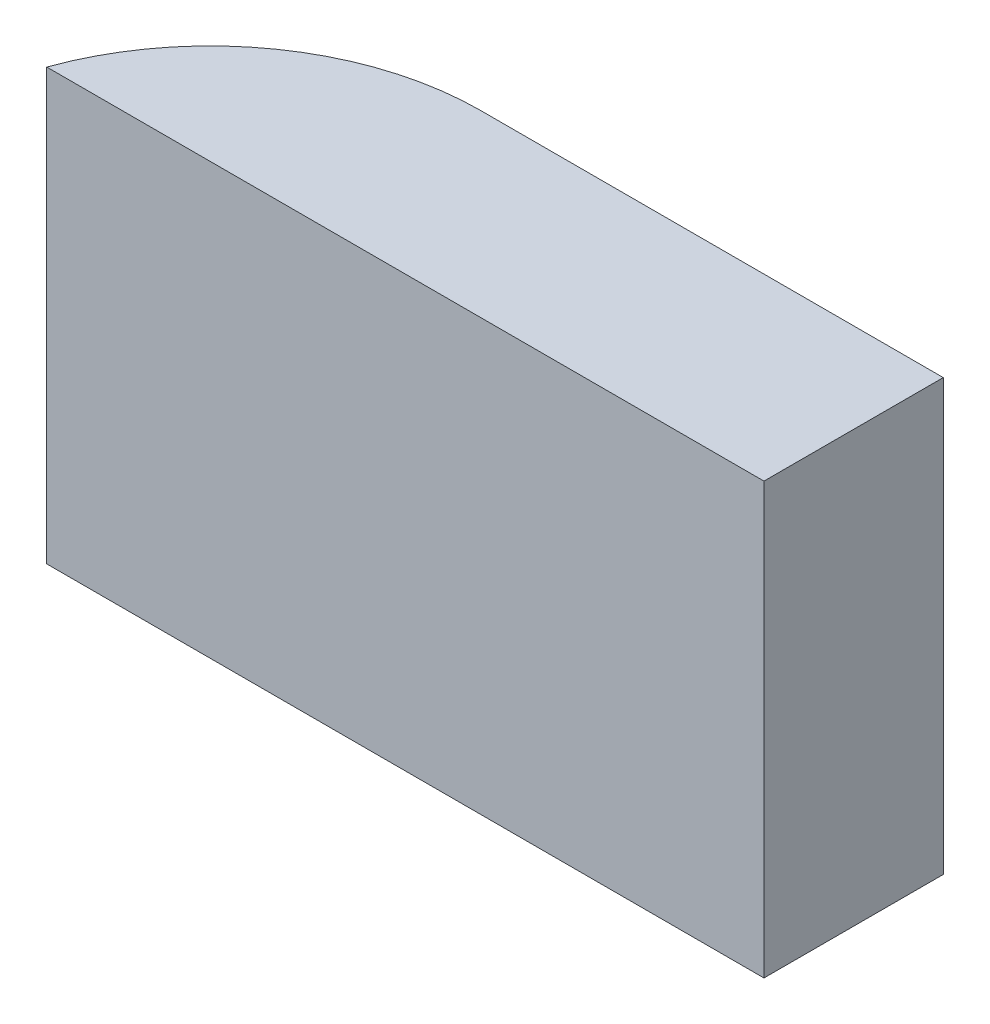
ISO-10303-21;
HEADER;
FILE_DESCRIPTION(('STEP AP214'),'2;1');
FILE_NAME('part.step','',(''),(''),'','','');
FILE_SCHEMA(('AUTOMOTIVE_DESIGN { 1 0 10303 214 1 1 1 1 }'));
ENDSEC;
DATA;
#1=APPLICATION_CONTEXT('core data for automotive mechanical design processes');
#2=APPLICATION_PROTOCOL_DEFINITION('international standard','automotive_design',2000,#1);
#3=PRODUCT_CONTEXT('',#1,'mechanical');
#4=PRODUCT('Part','Part','',(#3));
#5=PRODUCT_RELATED_PRODUCT_CATEGORY('part','',(#4));
#6=PRODUCT_DEFINITION_FORMATION('','',#4);
#7=PRODUCT_DEFINITION_CONTEXT('part definition',#1,'design');
#8=PRODUCT_DEFINITION('design','',#6,#7);
#9=PRODUCT_DEFINITION_SHAPE('','',#8);
#10=(LENGTH_UNIT() NAMED_UNIT(*) SI_UNIT(.MILLI.,.METRE.));
#11=(NAMED_UNIT(*) PLANE_ANGLE_UNIT() SI_UNIT($,.RADIAN.));
#12=(NAMED_UNIT(*) SI_UNIT($,.STERADIAN.) SOLID_ANGLE_UNIT());
#13=UNCERTAINTY_MEASURE_WITH_UNIT(LENGTH_MEASURE(1.E-05),#10,'distance_accuracy_value','');
#14=(GEOMETRIC_REPRESENTATION_CONTEXT(3) GLOBAL_UNCERTAINTY_ASSIGNED_CONTEXT((#13)) GLOBAL_UNIT_ASSIGNED_CONTEXT((#10,
#11,#12)) REPRESENTATION_CONTEXT('',''));
#15=CARTESIAN_POINT('',(0.,0.,0.));
#16=DIRECTION('',(0.,0.,1.));
#17=DIRECTION('',(1.,0.,0.));
#18=AXIS2_PLACEMENT_3D('',#15,#16,#17);
#19=CARTESIAN_POINT('',(0.,76.2,0.));
#20=DIRECTION('',(0.,0.,1.));
#21=DIRECTION('',(1.,0.,0.));
#22=AXIS2_PLACEMENT_3D('',#19,#20,#21);
#23=PLANE('',#22);
#24=DIRECTION('',(-1.,0.,0.));
#25=VECTOR('',#24,1.);
#26=CARTESIAN_POINT('',(0.,0.,0.));
#27=LINE('',#26,#25);
#28=CARTESIAN_POINT('',(0.,0.,0.));
#29=VERTEX_POINT('',#28);
#30=CARTESIAN_POINT('',(-81.8677685950414,0.,0.));
#31=VERTEX_POINT('',#30);
#32=EDGE_CURVE('E107',#29,#31,#27,.T.);
#33=ORIENTED_EDGE('',*,*,#32,.T.);
#34=DIRECTION('',(0.,-1.,0.));
#35=VECTOR('',#34,1.);
#36=CARTESIAN_POINT('',(-81.8677685950414,76.2,0.));
#37=LINE('',#36,#35);
#38=CARTESIAN_POINT('',(-81.8677685950414,76.2,0.));
#39=VERTEX_POINT('',#38);
#40=EDGE_CURVE('E11',#39,#31,#37,.T.);
#41=ORIENTED_EDGE('',*,*,#40,.F.);
#42=DIRECTION('',(-1.,0.,0.));
#43=VECTOR('',#42,1.);
#44=CARTESIAN_POINT('',(0.,76.2,0.));
#45=LINE('',#44,#43);
#46=CARTESIAN_POINT('',(0.,76.2,0.));
#47=VERTEX_POINT('',#46);
#48=EDGE_CURVE('E91',#47,#39,#45,.T.);
#49=ORIENTED_EDGE('',*,*,#48,.F.);
#50=DIRECTION('',(0.,-1.,0.));
#51=VECTOR('',#50,1.);
#52=CARTESIAN_POINT('',(0.,76.2,0.));
#53=LINE('',#52,#51);
#54=EDGE_CURVE('E103',#47,#29,#53,.T.);
#55=ORIENTED_EDGE('',*,*,#54,.T.);
#56=EDGE_LOOP('',(#33,#41,#49,#55));
#57=FACE_BOUND('',#56,.T.);
#58=ADVANCED_FACE('F39',(#57),#23,.F.);
#59=CARTESIAN_POINT('',(-81.8677685950414,76.2,47.9524537258383));
#60=DIRECTION('',(0.,-1.,0.));
#61=DIRECTION('',(0.,0.,-1.));
#62=AXIS2_PLACEMENT_3D('',#59,#60,#61);
#63=CYLINDRICAL_SURFACE('',#62,47.9524537258383);
#64=CARTESIAN_POINT('',(-81.8677685950414,0.,47.9524537258383));
#65=DIRECTION('',(0.,1.,0.));
#66=DIRECTION('',(0.,0.,1.));
#67=AXIS2_PLACEMENT_3D('',#64,#65,#66);
#68=CIRCLE('',#67,47.9524537258383);
#69=CARTESIAN_POINT('',(-127.,0.,31.75));
#70=VERTEX_POINT('',#69);
#71=EDGE_CURVE('E96',#31,#70,#68,.T.);
#72=ORIENTED_EDGE('',*,*,#71,.T.);
#73=DIRECTION('',(0.,-1.,0.));
#74=VECTOR('',#73,1.);
#75=CARTESIAN_POINT('',(-127.,76.2,31.75));
#76=LINE('',#75,#74);
#77=CARTESIAN_POINT('',(-127.,76.2,31.75));
#78=VERTEX_POINT('',#77);
#79=EDGE_CURVE('E48',#78,#70,#76,.T.);
#80=ORIENTED_EDGE('',*,*,#79,.F.);
#81=CARTESIAN_POINT('',(-81.8677685950414,76.2,47.9524537258383));
#82=DIRECTION('',(0.,1.,0.));
#83=DIRECTION('',(0.,0.,1.));
#84=AXIS2_PLACEMENT_3D('',#81,#82,#83);
#85=CIRCLE('',#84,47.9524537258383);
#86=EDGE_CURVE('E86',#39,#78,#85,.T.);
#87=ORIENTED_EDGE('',*,*,#86,.F.);
#88=ORIENTED_EDGE('',*,*,#40,.T.);
#89=EDGE_LOOP('',(#72,#80,#87,#88));
#90=FACE_BOUND('',#89,.T.);
#91=ADVANCED_FACE('F95',(#90),#63,.T.);
#92=CARTESIAN_POINT('',(0.,76.2,31.75));
#93=DIRECTION('',(0.,0.,-1.));
#94=DIRECTION('',(-1.,0.,0.));
#95=AXIS2_PLACEMENT_3D('',#92,#93,#94);
#96=PLANE('',#95);
#97=DIRECTION('',(1.,0.,0.));
#98=VECTOR('',#97,1.);
#99=CARTESIAN_POINT('',(0.,0.,31.75));
#100=LINE('',#99,#98);
#101=CARTESIAN_POINT('',(0.,0.,31.75));
#102=VERTEX_POINT('',#101);
#103=EDGE_CURVE('E73',#70,#102,#100,.T.);
#104=ORIENTED_EDGE('',*,*,#103,.T.);
#105=DIRECTION('',(0.,-1.,0.));
#106=VECTOR('',#105,1.);
#107=CARTESIAN_POINT('',(0.,76.2,31.75));
#108=LINE('',#107,#106);
#109=CARTESIAN_POINT('',(0.,76.2,31.75));
#110=VERTEX_POINT('',#109);
#111=EDGE_CURVE('E98',#110,#102,#108,.T.);
#112=ORIENTED_EDGE('',*,*,#111,.F.);
#113=DIRECTION('',(1.,0.,0.));
#114=VECTOR('',#113,1.);
#115=CARTESIAN_POINT('',(0.,76.2,31.75));
#116=LINE('',#115,#114);
#117=EDGE_CURVE('E89',#78,#110,#116,.T.);
#118=ORIENTED_EDGE('',*,*,#117,.F.);
#119=ORIENTED_EDGE('',*,*,#79,.T.);
#120=EDGE_LOOP('',(#104,#112,#118,#119));
#121=FACE_BOUND('',#120,.T.);
#122=ADVANCED_FACE('F99',(#121),#96,.F.);
#123=CARTESIAN_POINT('',(0.,76.2,0.));
#124=DIRECTION('',(-1.,0.,0.));
#125=DIRECTION('',(0.,0.,1.));
#126=AXIS2_PLACEMENT_3D('',#123,#124,#125);
#127=PLANE('',#126);
#128=DIRECTION('',(0.,0.,-1.));
#129=VECTOR('',#128,1.);
#130=CARTESIAN_POINT('',(0.,0.,0.));
#131=LINE('',#130,#129);
#132=EDGE_CURVE('E79',#102,#29,#131,.T.);
#133=ORIENTED_EDGE('',*,*,#132,.T.);
#134=ORIENTED_EDGE('',*,*,#54,.F.);
#135=DIRECTION('',(0.,0.,-1.));
#136=VECTOR('',#135,1.);
#137=CARTESIAN_POINT('',(0.,76.2,0.));
#138=LINE('',#137,#136);
#139=EDGE_CURVE('E56',#110,#47,#138,.T.);
#140=ORIENTED_EDGE('',*,*,#139,.F.);
#141=ORIENTED_EDGE('',*,*,#111,.T.);
#142=EDGE_LOOP('',(#133,#134,#140,#141));
#143=FACE_BOUND('',#142,.T.);
#144=ADVANCED_FACE('F120',(#143),#127,.F.);
#145=CARTESIAN_POINT('',(-81.8677685950414,76.2,47.9524537258383));
#146=DIRECTION('',(0.,1.,0.));
#147=DIRECTION('',(0.,0.,1.));
#148=AXIS2_PLACEMENT_3D('',#145,#146,#147);
#149=PLANE('',#148);
#150=ORIENTED_EDGE('',*,*,#48,.T.);
#151=ORIENTED_EDGE('',*,*,#86,.T.);
#152=ORIENTED_EDGE('',*,*,#117,.T.);
#153=ORIENTED_EDGE('',*,*,#139,.T.);
#154=EDGE_LOOP('',(#150,#151,#152,#153));
#155=FACE_BOUND('',#154,.T.);
#156=ADVANCED_FACE('F87',(#155),#149,.T.);
#157=CARTESIAN_POINT('',(-81.8677685950414,0.,47.9524537258383));
#158=DIRECTION('',(0.,1.,0.));
#159=DIRECTION('',(0.,0.,1.));
#160=AXIS2_PLACEMENT_3D('',#157,#158,#159);
#161=PLANE('',#160);
#162=ORIENTED_EDGE('',*,*,#32,.F.);
#163=ORIENTED_EDGE('',*,*,#132,.F.);
#164=ORIENTED_EDGE('',*,*,#103,.F.);
#165=ORIENTED_EDGE('',*,*,#71,.F.);
#166=EDGE_LOOP('',(#162,#163,#164,#165));
#167=FACE_BOUND('',#166,.T.);
#168=ADVANCED_FACE('F123',(#167),#161,.F.);
#169=CLOSED_SHELL('',(#58,#91,#122,#144,#156,#168));
#170=MANIFOLD_SOLID_BREP('B2',#169);
#171=ADVANCED_BREP_SHAPE_REPRESENTATION('',(#18,#170),#14);
#172=SHAPE_DEFINITION_REPRESENTATION(#9,#171);
ENDSEC;
END-ISO-10303-21;
